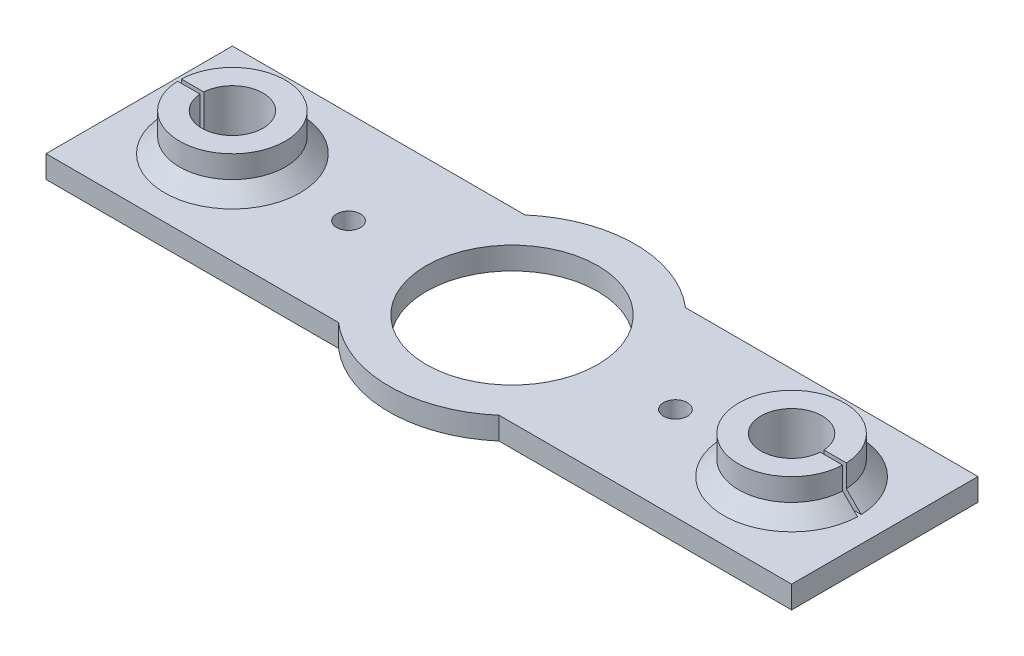
ISO-10303-21;
HEADER;
FILE_DESCRIPTION(('STEP AP214'),'2;1');
FILE_NAME('part.step','',(''),(''),'','','');
FILE_SCHEMA(('AUTOMOTIVE_DESIGN { 1 0 10303 214 1 1 1 1 }'));
ENDSEC;
DATA;
#1=APPLICATION_CONTEXT('core data for automotive mechanical design processes');
#2=APPLICATION_PROTOCOL_DEFINITION('international standard','automotive_design',2000,#1);
#3=PRODUCT_CONTEXT('',#1,'mechanical');
#4=PRODUCT('Part','Part','',(#3));
#5=PRODUCT_RELATED_PRODUCT_CATEGORY('part','',(#4));
#6=PRODUCT_DEFINITION_FORMATION('','',#4);
#7=PRODUCT_DEFINITION_CONTEXT('part definition',#1,'design');
#8=PRODUCT_DEFINITION('design','',#6,#7);
#9=PRODUCT_DEFINITION_SHAPE('','',#8);
#10=(LENGTH_UNIT() NAMED_UNIT(*) SI_UNIT(.MILLI.,.METRE.));
#11=(NAMED_UNIT(*) PLANE_ANGLE_UNIT() SI_UNIT($,.RADIAN.));
#12=(NAMED_UNIT(*) SI_UNIT($,.STERADIAN.) SOLID_ANGLE_UNIT());
#13=UNCERTAINTY_MEASURE_WITH_UNIT(LENGTH_MEASURE(1.E-05),#10,'distance_accuracy_value','');
#14=(GEOMETRIC_REPRESENTATION_CONTEXT(3) GLOBAL_UNCERTAINTY_ASSIGNED_CONTEXT((#13)) GLOBAL_UNIT_ASSIGNED_CONTEXT((#10,
#11,#12)) REPRESENTATION_CONTEXT('',''));
#15=CARTESIAN_POINT('',(0.,0.,0.));
#16=DIRECTION('',(0.,0.,1.));
#17=DIRECTION('',(1.,0.,0.));
#18=AXIS2_PLACEMENT_3D('',#15,#16,#17);
#19=CARTESIAN_POINT('',(0.,3.,12.5));
#20=DIRECTION('',(0.,0.,1.));
#21=DIRECTION('',(1.,0.,0.));
#22=AXIS2_PLACEMENT_3D('',#19,#20,#21);
#23=PLANE('',#22);
#24=DIRECTION('',(-1.,0.,0.));
#25=VECTOR('',#24,1.);
#26=CARTESIAN_POINT('',(0.,0.,12.5));
#27=LINE('',#26,#25);
#28=CARTESIAN_POINT('',(-10.770329614269,0.,12.5));
#29=VERTEX_POINT('',#28);
#30=CARTESIAN_POINT('',(-50.,0.,12.5));
#31=VERTEX_POINT('',#30);
#32=EDGE_CURVE('E227',#29,#31,#27,.T.);
#33=ORIENTED_EDGE('',*,*,#32,.F.);
#34=DIRECTION('',(0.,-1.,0.));
#35=VECTOR('',#34,1.);
#36=CARTESIAN_POINT('',(-10.770329614269,3.,12.5));
#37=LINE('',#36,#35);
#38=CARTESIAN_POINT('',(-10.770329614269,3.,12.5));
#39=VERTEX_POINT('',#38);
#40=EDGE_CURVE('E314',#39,#29,#37,.T.);
#41=ORIENTED_EDGE('',*,*,#40,.F.);
#42=DIRECTION('',(-1.,0.,0.));
#43=VECTOR('',#42,1.);
#44=CARTESIAN_POINT('',(0.,3.,12.5));
#45=LINE('',#44,#43);
#46=CARTESIAN_POINT('',(-50.,3.,12.5));
#47=VERTEX_POINT('',#46);
#48=EDGE_CURVE('E228',#39,#47,#45,.T.);
#49=ORIENTED_EDGE('',*,*,#48,.T.);
#50=DIRECTION('',(0.,-1.,0.));
#51=VECTOR('',#50,1.);
#52=CARTESIAN_POINT('',(-50.,3.,12.5));
#53=LINE('',#52,#51);
#54=EDGE_CURVE('E263',#47,#31,#53,.T.);
#55=ORIENTED_EDGE('',*,*,#54,.T.);
#56=EDGE_LOOP('',(#33,#41,#49,#55));
#57=FACE_BOUND('',#56,.T.);
#58=ADVANCED_FACE('F34',(#57),#23,.T.);
#59=CARTESIAN_POINT('',(0.,3.,0.));
#60=DIRECTION('',(0.,-1.,0.));
#61=DIRECTION('',(0.,0.,-1.));
#62=AXIS2_PLACEMENT_3D('',#59,#60,#61);
#63=CYLINDRICAL_SURFACE('',#62,16.5);
#64=CARTESIAN_POINT('',(0.,0.,0.));
#65=DIRECTION('',(0.,1.,0.));
#66=DIRECTION('',(0.,0.,1.));
#67=AXIS2_PLACEMENT_3D('',#64,#65,#66);
#68=CIRCLE('',#67,16.5);
#69=CARTESIAN_POINT('',(10.770329614269,0.,12.5));
#70=VERTEX_POINT('',#69);
#71=EDGE_CURVE('E266',#29,#70,#68,.T.);
#72=ORIENTED_EDGE('',*,*,#71,.T.);
#73=DIRECTION('',(0.,-1.,0.));
#74=VECTOR('',#73,1.);
#75=CARTESIAN_POINT('',(10.770329614269,3.,12.5));
#76=LINE('',#75,#74);
#77=CARTESIAN_POINT('',(10.770329614269,3.,12.5));
#78=VERTEX_POINT('',#77);
#79=EDGE_CURVE('E312',#78,#70,#76,.T.);
#80=ORIENTED_EDGE('',*,*,#79,.F.);
#81=CARTESIAN_POINT('',(0.,3.,0.));
#82=DIRECTION('',(0.,1.,0.));
#83=DIRECTION('',(0.,0.,1.));
#84=AXIS2_PLACEMENT_3D('',#81,#82,#83);
#85=CIRCLE('',#84,16.5);
#86=EDGE_CURVE('E231',#39,#78,#85,.T.);
#87=ORIENTED_EDGE('',*,*,#86,.F.);
#88=ORIENTED_EDGE('',*,*,#40,.T.);
#89=EDGE_LOOP('',(#72,#80,#87,#88));
#90=FACE_BOUND('',#89,.T.);
#91=ADVANCED_FACE('F347',(#90),#63,.T.);
#92=CARTESIAN_POINT('',(0.,3.,12.5));
#93=DIRECTION('',(0.,0.,1.));
#94=DIRECTION('',(1.,0.,0.));
#95=AXIS2_PLACEMENT_3D('',#92,#93,#94);
#96=PLANE('',#95);
#97=DIRECTION('',(-1.,0.,0.));
#98=VECTOR('',#97,1.);
#99=CARTESIAN_POINT('',(0.,0.,12.5));
#100=LINE('',#99,#98);
#101=CARTESIAN_POINT('',(50.,0.,12.5));
#102=VERTEX_POINT('',#101);
#103=EDGE_CURVE('E269',#102,#70,#100,.T.);
#104=ORIENTED_EDGE('',*,*,#103,.F.);
#105=DIRECTION('',(0.,-1.,0.));
#106=VECTOR('',#105,1.);
#107=CARTESIAN_POINT('',(50.,3.,12.5));
#108=LINE('',#107,#106);
#109=CARTESIAN_POINT('',(50.,3.,12.5));
#110=VERTEX_POINT('',#109);
#111=EDGE_CURVE('E310',#110,#102,#108,.T.);
#112=ORIENTED_EDGE('',*,*,#111,.F.);
#113=DIRECTION('',(-1.,0.,0.));
#114=VECTOR('',#113,1.);
#115=CARTESIAN_POINT('',(0.,3.,12.5));
#116=LINE('',#115,#114);
#117=EDGE_CURVE('E234',#110,#78,#116,.T.);
#118=ORIENTED_EDGE('',*,*,#117,.T.);
#119=ORIENTED_EDGE('',*,*,#79,.T.);
#120=EDGE_LOOP('',(#104,#112,#118,#119));
#121=FACE_BOUND('',#120,.T.);
#122=ADVANCED_FACE('F351',(#121),#96,.T.);
#123=CARTESIAN_POINT('',(50.,3.,0.));
#124=DIRECTION('',(-1.,0.,0.));
#125=DIRECTION('',(0.,0.,1.));
#126=AXIS2_PLACEMENT_3D('',#123,#124,#125);
#127=PLANE('',#126);
#128=DIRECTION('',(0.,0.,-1.));
#129=VECTOR('',#128,1.);
#130=CARTESIAN_POINT('',(50.,0.,0.));
#131=LINE('',#130,#129);
#132=CARTESIAN_POINT('',(50.,0.,-12.5));
#133=VERTEX_POINT('',#132);
#134=EDGE_CURVE('E272',#102,#133,#131,.T.);
#135=ORIENTED_EDGE('',*,*,#134,.T.);
#136=DIRECTION('',(0.,-1.,0.));
#137=VECTOR('',#136,1.);
#138=CARTESIAN_POINT('',(50.,3.,-12.5));
#139=LINE('',#138,#137);
#140=CARTESIAN_POINT('',(50.,3.,-12.5));
#141=VERTEX_POINT('',#140);
#142=EDGE_CURVE('E307',#141,#133,#139,.T.);
#143=ORIENTED_EDGE('',*,*,#142,.F.);
#144=DIRECTION('',(0.,0.,-1.));
#145=VECTOR('',#144,1.);
#146=CARTESIAN_POINT('',(50.,3.,0.));
#147=LINE('',#146,#145);
#148=EDGE_CURVE('E237',#110,#141,#147,.T.);
#149=ORIENTED_EDGE('',*,*,#148,.F.);
#150=ORIENTED_EDGE('',*,*,#111,.T.);
#151=EDGE_LOOP('',(#135,#143,#149,#150));
#152=FACE_BOUND('',#151,.T.);
#153=ADVANCED_FACE('F355',(#152),#127,.F.);
#154=CARTESIAN_POINT('',(0.,3.,-12.5));
#155=DIRECTION('',(0.,0.,1.));
#156=DIRECTION('',(1.,0.,0.));
#157=AXIS2_PLACEMENT_3D('',#154,#155,#156);
#158=PLANE('',#157);
#159=DIRECTION('',(-1.,0.,0.));
#160=VECTOR('',#159,1.);
#161=CARTESIAN_POINT('',(0.,0.,-12.5));
#162=LINE('',#161,#160);
#163=CARTESIAN_POINT('',(10.770329614269,0.,-12.5));
#164=VERTEX_POINT('',#163);
#165=EDGE_CURVE('E274',#133,#164,#162,.T.);
#166=ORIENTED_EDGE('',*,*,#165,.T.);
#167=DIRECTION('',(0.,-1.,0.));
#168=VECTOR('',#167,1.);
#169=CARTESIAN_POINT('',(10.770329614269,3.,-12.5));
#170=LINE('',#169,#168);
#171=CARTESIAN_POINT('',(10.770329614269,3.,-12.5));
#172=VERTEX_POINT('',#171);
#173=EDGE_CURVE('E304',#172,#164,#170,.T.);
#174=ORIENTED_EDGE('',*,*,#173,.F.);
#175=DIRECTION('',(-1.,0.,0.));
#176=VECTOR('',#175,1.);
#177=CARTESIAN_POINT('',(0.,3.,-12.5));
#178=LINE('',#177,#176);
#179=EDGE_CURVE('E239',#141,#172,#178,.T.);
#180=ORIENTED_EDGE('',*,*,#179,.F.);
#181=ORIENTED_EDGE('',*,*,#142,.T.);
#182=EDGE_LOOP('',(#166,#174,#180,#181));
#183=FACE_BOUND('',#182,.T.);
#184=ADVANCED_FACE('F359',(#183),#158,.F.);
#185=CARTESIAN_POINT('',(0.,3.,0.));
#186=DIRECTION('',(0.,-1.,0.));
#187=DIRECTION('',(0.,0.,-1.));
#188=AXIS2_PLACEMENT_3D('',#185,#186,#187);
#189=CYLINDRICAL_SURFACE('',#188,16.5);
#190=CARTESIAN_POINT('',(0.,0.,0.));
#191=DIRECTION('',(0.,1.,0.));
#192=DIRECTION('',(0.,0.,1.));
#193=AXIS2_PLACEMENT_3D('',#190,#191,#192);
#194=CIRCLE('',#193,16.5);
#195=CARTESIAN_POINT('',(-10.770329614269,0.,-12.5));
#196=VERTEX_POINT('',#195);
#197=EDGE_CURVE('E276',#164,#196,#194,.T.);
#198=ORIENTED_EDGE('',*,*,#197,.T.);
#199=DIRECTION('',(0.,-1.,0.));
#200=VECTOR('',#199,1.);
#201=CARTESIAN_POINT('',(-10.770329614269,3.,-12.5));
#202=LINE('',#201,#200);
#203=CARTESIAN_POINT('',(-10.770329614269,3.,-12.5));
#204=VERTEX_POINT('',#203);
#205=EDGE_CURVE('E301',#204,#196,#202,.T.);
#206=ORIENTED_EDGE('',*,*,#205,.F.);
#207=CARTESIAN_POINT('',(0.,3.,0.));
#208=DIRECTION('',(0.,1.,0.));
#209=DIRECTION('',(0.,0.,1.));
#210=AXIS2_PLACEMENT_3D('',#207,#208,#209);
#211=CIRCLE('',#210,16.5);
#212=EDGE_CURVE('E241',#172,#204,#211,.T.);
#213=ORIENTED_EDGE('',*,*,#212,.F.);
#214=ORIENTED_EDGE('',*,*,#173,.T.);
#215=EDGE_LOOP('',(#198,#206,#213,#214));
#216=FACE_BOUND('',#215,.T.);
#217=ADVANCED_FACE('F363',(#216),#189,.T.);
#218=CARTESIAN_POINT('',(0.,3.,-12.5));
#219=DIRECTION('',(0.,0.,1.));
#220=DIRECTION('',(1.,0.,0.));
#221=AXIS2_PLACEMENT_3D('',#218,#219,#220);
#222=PLANE('',#221);
#223=DIRECTION('',(-1.,0.,0.));
#224=VECTOR('',#223,1.);
#225=CARTESIAN_POINT('',(0.,0.,-12.5));
#226=LINE('',#225,#224);
#227=CARTESIAN_POINT('',(-50.,0.,-12.5));
#228=VERTEX_POINT('',#227);
#229=EDGE_CURVE('E278',#196,#228,#226,.T.);
#230=ORIENTED_EDGE('',*,*,#229,.T.);
#231=DIRECTION('',(0.,-1.,0.));
#232=VECTOR('',#231,1.);
#233=CARTESIAN_POINT('',(-50.,3.,-12.5));
#234=LINE('',#233,#232);
#235=CARTESIAN_POINT('',(-50.,3.,-12.5));
#236=VERTEX_POINT('',#235);
#237=EDGE_CURVE('E299',#236,#228,#234,.T.);
#238=ORIENTED_EDGE('',*,*,#237,.F.);
#239=DIRECTION('',(-1.,0.,0.));
#240=VECTOR('',#239,1.);
#241=CARTESIAN_POINT('',(0.,3.,-12.5));
#242=LINE('',#241,#240);
#243=EDGE_CURVE('E243',#204,#236,#242,.T.);
#244=ORIENTED_EDGE('',*,*,#243,.F.);
#245=ORIENTED_EDGE('',*,*,#205,.T.);
#246=EDGE_LOOP('',(#230,#238,#244,#245));
#247=FACE_BOUND('',#246,.T.);
#248=ADVANCED_FACE('F367',(#247),#222,.F.);
#249=CARTESIAN_POINT('',(21.92,3.,0.));
#250=DIRECTION('',(0.,-1.,0.));
#251=DIRECTION('',(0.,0.,-1.));
#252=AXIS2_PLACEMENT_3D('',#249,#250,#251);
#253=CYLINDRICAL_SURFACE('',#252,1.6);
#254=CARTESIAN_POINT('',(21.92,3.,0.));
#255=DIRECTION('',(0.,1.,0.));
#256=DIRECTION('',(0.,0.,1.));
#257=AXIS2_PLACEMENT_3D('',#254,#255,#256);
#258=CIRCLE('',#257,1.6);
#259=CARTESIAN_POINT('',(21.92,3.,1.6));
#260=VERTEX_POINT('',#259);
#261=EDGE_CURVE('E257',#260,#260,#258,.F.);
#262=ORIENTED_EDGE('',*,*,#261,.F.);
#263=EDGE_LOOP('',(#262));
#264=FACE_BOUND('',#263,.T.);
#265=CARTESIAN_POINT('',(21.92,0.,0.));
#266=DIRECTION('',(0.,1.,0.));
#267=DIRECTION('',(0.,0.,1.));
#268=AXIS2_PLACEMENT_3D('',#265,#266,#267);
#269=CIRCLE('',#268,1.6);
#270=CARTESIAN_POINT('',(21.92,0.,1.6));
#271=VERTEX_POINT('',#270);
#272=EDGE_CURVE('E293',#271,#271,#269,.F.);
#273=ORIENTED_EDGE('',*,*,#272,.T.);
#274=EDGE_LOOP('',(#273));
#275=FACE_BOUND('',#274,.T.);
#276=ADVANCED_FACE('F371',(#264,#275),#253,.F.);
#277=CARTESIAN_POINT('',(0.,3.,0.));
#278=DIRECTION('',(0.,-1.,0.));
#279=DIRECTION('',(0.,0.,-1.));
#280=AXIS2_PLACEMENT_3D('',#277,#278,#279);
#281=CYLINDRICAL_SURFACE('',#280,11.5);
#282=CARTESIAN_POINT('',(0.,3.,0.));
#283=DIRECTION('',(0.,1.,0.));
#284=DIRECTION('',(0.,0.,1.));
#285=AXIS2_PLACEMENT_3D('',#282,#283,#284);
#286=CIRCLE('',#285,11.5);
#287=CARTESIAN_POINT('',(0.,3.,11.5));
#288=VERTEX_POINT('',#287);
#289=EDGE_CURVE('E254',#288,#288,#286,.T.);
#290=ORIENTED_EDGE('',*,*,#289,.T.);
#291=EDGE_LOOP('',(#290));
#292=FACE_BOUND('',#291,.T.);
#293=CARTESIAN_POINT('',(0.,0.,0.));
#294=DIRECTION('',(0.,1.,0.));
#295=DIRECTION('',(0.,0.,1.));
#296=AXIS2_PLACEMENT_3D('',#293,#294,#295);
#297=CIRCLE('',#296,11.5);
#298=CARTESIAN_POINT('',(0.,0.,11.5));
#299=VERTEX_POINT('',#298);
#300=EDGE_CURVE('E290',#299,#299,#297,.T.);
#301=ORIENTED_EDGE('',*,*,#300,.F.);
#302=EDGE_LOOP('',(#301));
#303=FACE_BOUND('',#302,.T.);
#304=ADVANCED_FACE('F385',(#292,#303),#281,.F.);
#305=CARTESIAN_POINT('',(-21.92,3.,0.));
#306=DIRECTION('',(0.,-1.,0.));
#307=DIRECTION('',(0.,0.,-1.));
#308=AXIS2_PLACEMENT_3D('',#305,#306,#307);
#309=CYLINDRICAL_SURFACE('',#308,1.6);
#310=CARTESIAN_POINT('',(-21.92,3.,0.));
#311=DIRECTION('',(0.,1.,0.));
#312=DIRECTION('',(0.,0.,1.));
#313=AXIS2_PLACEMENT_3D('',#310,#311,#312);
#314=CIRCLE('',#313,1.6);
#315=CARTESIAN_POINT('',(-21.92,3.,1.6));
#316=VERTEX_POINT('',#315);
#317=EDGE_CURVE('E251',#316,#316,#314,.T.);
#318=ORIENTED_EDGE('',*,*,#317,.T.);
#319=EDGE_LOOP('',(#318));
#320=FACE_BOUND('',#319,.T.);
#321=CARTESIAN_POINT('',(-21.92,0.,0.));
#322=DIRECTION('',(0.,1.,0.));
#323=DIRECTION('',(0.,0.,1.));
#324=AXIS2_PLACEMENT_3D('',#321,#322,#323);
#325=CIRCLE('',#324,1.6);
#326=CARTESIAN_POINT('',(-21.92,0.,1.6));
#327=VERTEX_POINT('',#326);
#328=EDGE_CURVE('E287',#327,#327,#325,.T.);
#329=ORIENTED_EDGE('',*,*,#328,.F.);
#330=EDGE_LOOP('',(#329));
#331=FACE_BOUND('',#330,.T.);
#332=ADVANCED_FACE('F381',(#320,#331),#309,.F.);
#333=CARTESIAN_POINT('',(-37.5,3.,0.));
#334=DIRECTION('',(0.,-1.,0.));
#335=DIRECTION('',(0.,0.,-1.));
#336=AXIS2_PLACEMENT_3D('',#333,#334,#335);
#337=CYLINDRICAL_SURFACE('',#336,4.1);
#338=CARTESIAN_POINT('',(-37.5,3.,0.));
#339=DIRECTION('',(0.,1.,0.));
#340=DIRECTION('',(0.,0.,1.));
#341=AXIS2_PLACEMENT_3D('',#338,#339,#340);
#342=CIRCLE('',#341,4.1);
#343=CARTESIAN_POINT('',(-41.5923709509281,3.,-0.249999999999995));
#344=VERTEX_POINT('',#343);
#345=CARTESIAN_POINT('',(-41.5923709509281,3.,0.250000000000005));
#346=VERTEX_POINT('',#345);
#347=EDGE_CURVE('E248',#344,#346,#342,.T.);
#348=ORIENTED_EDGE('',*,*,#347,.T.);
#349=DIRECTION('',(0.,-1.,0.));
#350=VECTOR('',#349,1.);
#351=CARTESIAN_POINT('',(-41.5923709509281,8.,0.250000000000005));
#352=LINE('',#351,#350);
#353=CARTESIAN_POINT('',(-41.5923709509281,8.,0.250000000000005));
#354=VERTEX_POINT('',#353);
#355=EDGE_CURVE('E214',#354,#346,#352,.T.);
#356=ORIENTED_EDGE('',*,*,#355,.F.);
#357=CARTESIAN_POINT('',(-37.5,8.,0.));
#358=DIRECTION('',(0.,1.,0.));
#359=DIRECTION('',(0.,0.,1.));
#360=AXIS2_PLACEMENT_3D('',#357,#358,#359);
#361=CIRCLE('',#360,4.1);
#362=CARTESIAN_POINT('',(-41.5923709509281,8.,-0.249999999999995));
#363=VERTEX_POINT('',#362);
#364=EDGE_CURVE('E212',#363,#354,#361,.F.);
#365=ORIENTED_EDGE('',*,*,#364,.F.);
#366=DIRECTION('',(0.,-1.,0.));
#367=VECTOR('',#366,1.);
#368=CARTESIAN_POINT('',(-41.5923709509281,8.,-0.249999999999995));
#369=LINE('',#368,#367);
#370=EDGE_CURVE('E219',#363,#344,#369,.T.);
#371=ORIENTED_EDGE('',*,*,#370,.T.);
#372=EDGE_LOOP('',(#348,#356,#365,#371));
#373=FACE_BOUND('',#372,.T.);
#374=CARTESIAN_POINT('',(-37.5,0.,0.));
#375=DIRECTION('',(0.,1.,0.));
#376=DIRECTION('',(0.,0.,1.));
#377=AXIS2_PLACEMENT_3D('',#374,#375,#376);
#378=CIRCLE('',#377,4.1);
#379=CARTESIAN_POINT('',(-37.5,0.,4.1));
#380=VERTEX_POINT('',#379);
#381=EDGE_CURVE('E284',#380,#380,#378,.T.);
#382=ORIENTED_EDGE('',*,*,#381,.F.);
#383=EDGE_LOOP('',(#382));
#384=FACE_BOUND('',#383,.T.);
#385=ADVANCED_FACE('F377',(#373,#384),#337,.F.);
#386=CARTESIAN_POINT('',(-50.,3.,0.));
#387=DIRECTION('',(-1.,0.,0.));
#388=DIRECTION('',(0.,0.,1.));
#389=AXIS2_PLACEMENT_3D('',#386,#387,#388);
#390=PLANE('',#389);
#391=DIRECTION('',(0.,0.,-1.));
#392=VECTOR('',#391,1.);
#393=CARTESIAN_POINT('',(-50.,0.,0.));
#394=LINE('',#393,#392);
#395=EDGE_CURVE('E281',#31,#228,#394,.T.);
#396=ORIENTED_EDGE('',*,*,#395,.F.);
#397=ORIENTED_EDGE('',*,*,#54,.F.);
#398=DIRECTION('',(0.,0.,-1.));
#399=VECTOR('',#398,1.);
#400=CARTESIAN_POINT('',(-50.,3.,0.));
#401=LINE('',#400,#399);
#402=EDGE_CURVE('E245',#47,#236,#401,.T.);
#403=ORIENTED_EDGE('',*,*,#402,.T.);
#404=ORIENTED_EDGE('',*,*,#237,.T.);
#405=EDGE_LOOP('',(#396,#397,#403,#404));
#406=FACE_BOUND('',#405,.T.);
#407=ADVANCED_FACE('F373',(#406),#390,.T.);
#408=CARTESIAN_POINT('',(37.5,3.,0.));
#409=DIRECTION('',(0.,-1.,0.));
#410=DIRECTION('',(0.,0.,-1.));
#411=AXIS2_PLACEMENT_3D('',#408,#409,#410);
#412=CYLINDRICAL_SURFACE('',#411,4.1);
#413=CARTESIAN_POINT('',(37.5,3.,0.));
#414=DIRECTION('',(0.,1.,0.));
#415=DIRECTION('',(0.,0.,1.));
#416=AXIS2_PLACEMENT_3D('',#413,#414,#415);
#417=CIRCLE('',#416,4.1);
#418=CARTESIAN_POINT('',(41.5923709509281,3.,-0.249999999999995));
#419=VERTEX_POINT('',#418);
#420=CARTESIAN_POINT('',(41.5923709509281,3.,0.250000000000005));
#421=VERTEX_POINT('',#420);
#422=EDGE_CURVE('E260',#419,#421,#417,.F.);
#423=ORIENTED_EDGE('',*,*,#422,.F.);
#424=DIRECTION('',(0.,-1.,0.));
#425=VECTOR('',#424,1.);
#426=CARTESIAN_POINT('',(41.5923709509281,8.,-0.249999999999995));
#427=LINE('',#426,#425);
#428=CARTESIAN_POINT('',(41.5923709509281,8.,-0.249999999999995));
#429=VERTEX_POINT('',#428);
#430=EDGE_CURVE('E200',#429,#419,#427,.T.);
#431=ORIENTED_EDGE('',*,*,#430,.F.);
#432=CARTESIAN_POINT('',(37.5,8.,0.));
#433=DIRECTION('',(0.,1.,0.));
#434=DIRECTION('',(0.,0.,1.));
#435=AXIS2_PLACEMENT_3D('',#432,#433,#434);
#436=CIRCLE('',#435,4.1);
#437=CARTESIAN_POINT('',(41.5923709509281,8.,0.250000000000005));
#438=VERTEX_POINT('',#437);
#439=EDGE_CURVE('E190',#438,#429,#436,.F.);
#440=ORIENTED_EDGE('',*,*,#439,.F.);
#441=DIRECTION('',(0.,-1.,0.));
#442=VECTOR('',#441,1.);
#443=CARTESIAN_POINT('',(41.5923709509281,8.,0.250000000000005));
#444=LINE('',#443,#442);
#445=EDGE_CURVE('E176',#438,#421,#444,.T.);
#446=ORIENTED_EDGE('',*,*,#445,.T.);
#447=EDGE_LOOP('',(#423,#431,#440,#446));
#448=FACE_BOUND('',#447,.T.);
#449=CARTESIAN_POINT('',(37.5,0.,0.));
#450=DIRECTION('',(0.,1.,0.));
#451=DIRECTION('',(0.,0.,1.));
#452=AXIS2_PLACEMENT_3D('',#449,#450,#451);
#453=CIRCLE('',#452,4.1);
#454=CARTESIAN_POINT('',(37.5,0.,4.1));
#455=VERTEX_POINT('',#454);
#456=EDGE_CURVE('E232',#455,#455,#453,.F.);
#457=ORIENTED_EDGE('',*,*,#456,.T.);
#458=EDGE_LOOP('',(#457));
#459=FACE_BOUND('',#458,.T.);
#460=ADVANCED_FACE('F376',(#448,#459),#412,.F.);
#461=CARTESIAN_POINT('',(0.,3.,0.));
#462=DIRECTION('',(0.,1.,0.));
#463=DIRECTION('',(0.,0.,1.));
#464=AXIS2_PLACEMENT_3D('',#461,#462,#463);
#465=PLANE('',#464);
#466=CARTESIAN_POINT('',(37.5,3.,0.));
#467=DIRECTION('',(0.,1.,0.));
#468=DIRECTION('',(0.,0.,1.));
#469=AXIS2_PLACEMENT_3D('',#466,#467,#468);
#470=CIRCLE('',#469,9.09754007086547);
#471=CARTESIAN_POINT('',(46.59410442765,3.,0.250000000000006));
#472=VERTEX_POINT('',#471);
#473=CARTESIAN_POINT('',(46.59410442765,3.,-0.249999999999994));
#474=VERTEX_POINT('',#473);
#475=EDGE_CURVE('E319',#472,#474,#470,.F.);
#476=ORIENTED_EDGE('',*,*,#475,.T.);
#477=DIRECTION('',(1.,0.,0.));
#478=VECTOR('',#477,1.);
#479=CARTESIAN_POINT('',(0.,3.,-0.250000000000001));
#480=LINE('',#479,#478);
#481=EDGE_CURVE('E185',#419,#474,#480,.T.);
#482=ORIENTED_EDGE('',*,*,#481,.F.);
#483=ORIENTED_EDGE('',*,*,#422,.T.);
#484=DIRECTION('',(1.,0.,0.));
#485=VECTOR('',#484,1.);
#486=CARTESIAN_POINT('',(0.,3.,0.250000000000001));
#487=LINE('',#486,#485);
#488=EDGE_CURVE('E196',#421,#472,#487,.T.);
#489=ORIENTED_EDGE('',*,*,#488,.T.);
#490=EDGE_LOOP('',(#476,#482,#483,#489));
#491=FACE_BOUND('',#490,.T.);
#492=DIRECTION('',(-1.,0.,0.));
#493=VECTOR('',#492,1.);
#494=CARTESIAN_POINT('',(0.,3.,-0.250000000000001));
#495=LINE('',#494,#493);
#496=CARTESIAN_POINT('',(-46.5941044276499,3.,-0.249999999999994));
#497=VERTEX_POINT('',#496);
#498=EDGE_CURVE('E207',#344,#497,#495,.T.);
#499=ORIENTED_EDGE('',*,*,#498,.T.);
#500=CARTESIAN_POINT('',(-37.5,3.,0.));
#501=DIRECTION('',(0.,1.,0.));
#502=DIRECTION('',(0.,0.,1.));
#503=AXIS2_PLACEMENT_3D('',#500,#501,#502);
#504=CIRCLE('',#503,9.09754007086541);
#505=CARTESIAN_POINT('',(-46.5941044276499,3.,0.250000000000006));
#506=VERTEX_POINT('',#505);
#507=EDGE_CURVE('E316',#497,#506,#504,.F.);
#508=ORIENTED_EDGE('',*,*,#507,.T.);
#509=DIRECTION('',(-1.,0.,0.));
#510=VECTOR('',#509,1.);
#511=CARTESIAN_POINT('',(0.,3.,0.250000000000001));
#512=LINE('',#511,#510);
#513=EDGE_CURVE('E175',#346,#506,#512,.T.);
#514=ORIENTED_EDGE('',*,*,#513,.F.);
#515=ORIENTED_EDGE('',*,*,#347,.F.);
#516=EDGE_LOOP('',(#499,#508,#514,#515));
#517=FACE_BOUND('',#516,.T.);
#518=ORIENTED_EDGE('',*,*,#48,.F.);
#519=ORIENTED_EDGE('',*,*,#86,.T.);
#520=ORIENTED_EDGE('',*,*,#117,.F.);
#521=ORIENTED_EDGE('',*,*,#148,.T.);
#522=ORIENTED_EDGE('',*,*,#179,.T.);
#523=ORIENTED_EDGE('',*,*,#212,.T.);
#524=ORIENTED_EDGE('',*,*,#243,.T.);
#525=ORIENTED_EDGE('',*,*,#402,.F.);
#526=EDGE_LOOP('',(#518,#519,#520,#521,#522,#523,#524,#525));
#527=FACE_BOUND('',#526,.T.);
#528=ORIENTED_EDGE('',*,*,#317,.F.);
#529=EDGE_LOOP('',(#528));
#530=FACE_BOUND('',#529,.T.);
#531=ORIENTED_EDGE('',*,*,#289,.F.);
#532=EDGE_LOOP('',(#531));
#533=FACE_BOUND('',#532,.T.);
#534=ORIENTED_EDGE('',*,*,#261,.T.);
#535=EDGE_LOOP('',(#534));
#536=FACE_BOUND('',#535,.T.);
#537=ADVANCED_FACE('F395',(#491,#517,#527,#530,#533,#536),#465,.T.);
#538=CARTESIAN_POINT('',(0.,0.,0.));
#539=DIRECTION('',(0.,1.,0.));
#540=DIRECTION('',(0.,0.,1.));
#541=AXIS2_PLACEMENT_3D('',#538,#539,#540);
#542=PLANE('',#541);
#543=ORIENTED_EDGE('',*,*,#32,.T.);
#544=ORIENTED_EDGE('',*,*,#395,.T.);
#545=ORIENTED_EDGE('',*,*,#229,.F.);
#546=ORIENTED_EDGE('',*,*,#197,.F.);
#547=ORIENTED_EDGE('',*,*,#165,.F.);
#548=ORIENTED_EDGE('',*,*,#134,.F.);
#549=ORIENTED_EDGE('',*,*,#103,.T.);
#550=ORIENTED_EDGE('',*,*,#71,.F.);
#551=EDGE_LOOP('',(#543,#544,#545,#546,#547,#548,#549,#550));
#552=FACE_BOUND('',#551,.T.);
#553=ORIENTED_EDGE('',*,*,#381,.T.);
#554=EDGE_LOOP('',(#553));
#555=FACE_BOUND('',#554,.T.);
#556=ORIENTED_EDGE('',*,*,#328,.T.);
#557=EDGE_LOOP('',(#556));
#558=FACE_BOUND('',#557,.T.);
#559=ORIENTED_EDGE('',*,*,#300,.T.);
#560=EDGE_LOOP('',(#559));
#561=FACE_BOUND('',#560,.T.);
#562=ORIENTED_EDGE('',*,*,#272,.F.);
#563=EDGE_LOOP('',(#562));
#564=FACE_BOUND('',#563,.T.);
#565=ORIENTED_EDGE('',*,*,#456,.F.);
#566=EDGE_LOOP('',(#565));
#567=FACE_BOUND('',#566,.T.);
#568=ADVANCED_FACE('F397',(#552,#555,#558,#561,#564,#567),#542,.F.);
#569=CARTESIAN_POINT('',(0.,8.,0.250000000000001));
#570=DIRECTION('',(0.,0.,1.));
#571=DIRECTION('',(1.,0.,0.));
#572=AXIS2_PLACEMENT_3D('',#569,#570,#571);
#573=PLANE('',#572);
#574=ORIENTED_EDGE('',*,*,#513,.T.);
#575=CARTESIAN_POINT('',(-46.5941044276499,3.,0.250000000000006));
#576=CARTESIAN_POINT('',(-46.2606295935804,3.33335328505449,0.250000000000006));
#577=CARTESIAN_POINT('',(-45.9271447884612,3.66669659422999,0.250000000000006));
#578=CARTESIAN_POINT('',(-45.2601552360495,4.33336326089666,0.250000000000005));
#579=CARTESIAN_POINT('',(-44.9266504887571,4.66668661838783,0.250000000000005));
#580=CARTESIAN_POINT('',(-44.593135770415,4.99999999999999,0.250000000000005));
#581=B_SPLINE_CURVE_WITH_KNOTS('',3,(#575,#576,#577,#578,#579,#580),.UNSPECIFIED.,.F.,.F.,(4,2,
4),(0.,1.4145560763566,2.82911215302582),.UNSPECIFIED.);
#582=CARTESIAN_POINT('',(-44.593135770415,4.99999999999999,0.250000000000005));
#583=VERTEX_POINT('',#582);
#584=EDGE_CURVE('E11',#506,#583,#581,.T.);
#585=ORIENTED_EDGE('',*,*,#584,.T.);
#586=DIRECTION('',(0.,-1.,0.));
#587=VECTOR('',#586,1.);
#588=CARTESIAN_POINT('',(-44.593135770415,8.,0.250000000000005));
#589=LINE('',#588,#587);
#590=CARTESIAN_POINT('',(-44.593135770415,8.,0.250000000000005));
#591=VERTEX_POINT('',#590);
#592=EDGE_CURVE('E225',#591,#583,#589,.T.);
#593=ORIENTED_EDGE('',*,*,#592,.F.);
#594=DIRECTION('',(-1.,0.,0.));
#595=VECTOR('',#594,1.);
#596=CARTESIAN_POINT('',(0.,8.,0.250000000000001));
#597=LINE('',#596,#595);
#598=EDGE_CURVE('E203',#354,#591,#597,.T.);
#599=ORIENTED_EDGE('',*,*,#598,.F.);
#600=ORIENTED_EDGE('',*,*,#355,.T.);
#601=EDGE_LOOP('',(#574,#585,#593,#599,#600));
#602=FACE_BOUND('',#601,.T.);
#603=ADVANCED_FACE('F400',(#602),#573,.F.);
#604=CARTESIAN_POINT('',(-37.5,8.,0.));
#605=DIRECTION('',(0.,-1.,0.));
#606=DIRECTION('',(0.,0.,-1.));
#607=AXIS2_PLACEMENT_3D('',#604,#605,#606);
#608=CYLINDRICAL_SURFACE('',#607,7.09754007086545);
#609=ORIENTED_EDGE('',*,*,#592,.T.);
#610=CARTESIAN_POINT('',(-37.5,4.99999999999999,0.));
#611=DIRECTION('',(0.,1.,0.));
#612=DIRECTION('',(0.,0.,1.));
#613=AXIS2_PLACEMENT_3D('',#610,#611,#612);
#614=CIRCLE('',#613,7.09754007086545);
#615=CARTESIAN_POINT('',(-44.593135770415,4.99999999999999,-0.249999999999994));
#616=VERTEX_POINT('',#615);
#617=EDGE_CURVE('E323',#583,#616,#614,.T.);
#618=ORIENTED_EDGE('',*,*,#617,.T.);
#619=DIRECTION('',(0.,-1.,0.));
#620=VECTOR('',#619,1.);
#621=CARTESIAN_POINT('',(-44.593135770415,8.,-0.249999999999994));
#622=LINE('',#621,#620);
#623=CARTESIAN_POINT('',(-44.593135770415,8.,-0.249999999999994));
#624=VERTEX_POINT('',#623);
#625=EDGE_CURVE('E222',#624,#616,#622,.T.);
#626=ORIENTED_EDGE('',*,*,#625,.F.);
#627=CARTESIAN_POINT('',(-37.5,8.,0.));
#628=DIRECTION('',(0.,1.,0.));
#629=DIRECTION('',(0.,0.,1.));
#630=AXIS2_PLACEMENT_3D('',#627,#628,#629);
#631=CIRCLE('',#630,7.09754007086545);
#632=EDGE_CURVE('E206',#591,#624,#631,.T.);
#633=ORIENTED_EDGE('',*,*,#632,.F.);
#634=EDGE_LOOP('',(#609,#618,#626,#633));
#635=FACE_BOUND('',#634,.T.);
#636=ADVANCED_FACE('F407',(#635),#608,.T.);
#637=CARTESIAN_POINT('',(0.,8.,-0.250000000000001));
#638=DIRECTION('',(0.,0.,1.));
#639=DIRECTION('',(1.,0.,0.));
#640=AXIS2_PLACEMENT_3D('',#637,#638,#639);
#641=PLANE('',#640);
#642=ORIENTED_EDGE('',*,*,#498,.F.);
#643=ORIENTED_EDGE('',*,*,#370,.F.);
#644=DIRECTION('',(-1.,0.,0.));
#645=VECTOR('',#644,1.);
#646=CARTESIAN_POINT('',(0.,8.,-0.250000000000001));
#647=LINE('',#646,#645);
#648=EDGE_CURVE('E209',#363,#624,#647,.T.);
#649=ORIENTED_EDGE('',*,*,#648,.T.);
#650=ORIENTED_EDGE('',*,*,#625,.T.);
#651=CARTESIAN_POINT('',(-44.593135770415,4.99999999999999,-0.249999999999994));
#652=CARTESIAN_POINT('',(-44.9266504887571,4.66668661838783,-0.249999999999994));
#653=CARTESIAN_POINT('',(-45.2601552360495,4.33336326089666,-0.249999999999994));
#654=CARTESIAN_POINT('',(-45.9271447884612,3.66669659422999,-0.249999999999994));
#655=CARTESIAN_POINT('',(-46.2606295935804,3.33335328505449,-0.249999999999994));
#656=CARTESIAN_POINT('',(-46.5941044276499,3.,-0.249999999999994));
#657=B_SPLINE_CURVE_WITH_KNOTS('',3,(#651,#652,#653,#654,#655,#656),.UNSPECIFIED.,.F.,.F.,(4,2,
4),(0.,1.41455607666922,2.82911215302582),.UNSPECIFIED.);
#658=EDGE_CURVE('E47',#616,#497,#657,.T.);
#659=ORIENTED_EDGE('',*,*,#658,.T.);
#660=EDGE_LOOP('',(#642,#643,#649,#650,#659));
#661=FACE_BOUND('',#660,.T.);
#662=ADVANCED_FACE('F410',(#661),#641,.T.);
#663=CARTESIAN_POINT('',(0.,8.,0.));
#664=DIRECTION('',(0.,1.,0.));
#665=DIRECTION('',(0.,0.,1.));
#666=AXIS2_PLACEMENT_3D('',#663,#664,#665);
#667=PLANE('',#666);
#668=ORIENTED_EDGE('',*,*,#598,.T.);
#669=ORIENTED_EDGE('',*,*,#632,.T.);
#670=ORIENTED_EDGE('',*,*,#648,.F.);
#671=ORIENTED_EDGE('',*,*,#364,.T.);
#672=EDGE_LOOP('',(#668,#669,#670,#671));
#673=FACE_BOUND('',#672,.T.);
#674=ADVANCED_FACE('F415',(#673),#667,.T.);
#675=CARTESIAN_POINT('',(37.5,8.,0.));
#676=DIRECTION('',(0.,-1.,0.));
#677=DIRECTION('',(0.,0.,-1.));
#678=AXIS2_PLACEMENT_3D('',#675,#676,#677);
#679=CYLINDRICAL_SURFACE('',#678,7.09754007086545);
#680=DIRECTION('',(0.,-1.,0.));
#681=VECTOR('',#680,1.);
#682=CARTESIAN_POINT('',(44.593135770415,8.,-0.249999999999994));
#683=LINE('',#682,#681);
#684=CARTESIAN_POINT('',(44.593135770415,8.,-0.249999999999994));
#685=VERTEX_POINT('',#684);
#686=CARTESIAN_POINT('',(44.593135770415,4.99999999999999,-0.249999999999994));
#687=VERTEX_POINT('',#686);
#688=EDGE_CURVE('E195',#685,#687,#683,.T.);
#689=ORIENTED_EDGE('',*,*,#688,.T.);
#690=CARTESIAN_POINT('',(37.5,4.99999999999999,0.));
#691=DIRECTION('',(0.,1.,0.));
#692=DIRECTION('',(0.,0.,1.));
#693=AXIS2_PLACEMENT_3D('',#690,#691,#692);
#694=CIRCLE('',#693,7.09754007086545);
#695=CARTESIAN_POINT('',(44.593135770415,4.99999999999999,0.250000000000005));
#696=VERTEX_POINT('',#695);
#697=EDGE_CURVE('E170',#687,#696,#694,.T.);
#698=ORIENTED_EDGE('',*,*,#697,.T.);
#699=DIRECTION('',(0.,-1.,0.));
#700=VECTOR('',#699,1.);
#701=CARTESIAN_POINT('',(44.593135770415,8.,0.250000000000005));
#702=LINE('',#701,#700);
#703=CARTESIAN_POINT('',(44.593135770415,8.,0.250000000000005));
#704=VERTEX_POINT('',#703);
#705=EDGE_CURVE('E164',#704,#696,#702,.T.);
#706=ORIENTED_EDGE('',*,*,#705,.F.);
#707=CARTESIAN_POINT('',(37.5,8.,0.));
#708=DIRECTION('',(0.,1.,0.));
#709=DIRECTION('',(0.,0.,1.));
#710=AXIS2_PLACEMENT_3D('',#707,#708,#709);
#711=CIRCLE('',#710,7.09754007086545);
#712=EDGE_CURVE('E168',#704,#685,#711,.F.);
#713=ORIENTED_EDGE('',*,*,#712,.T.);
#714=EDGE_LOOP('',(#689,#698,#706,#713));
#715=FACE_BOUND('',#714,.T.);
#716=ADVANCED_FACE('F167',(#715),#679,.T.);
#717=CARTESIAN_POINT('',(0.,8.,0.250000000000001));
#718=DIRECTION('',(0.,0.,-1.));
#719=DIRECTION('',(-1.,0.,0.));
#720=AXIS2_PLACEMENT_3D('',#717,#718,#719);
#721=PLANE('',#720);
#722=ORIENTED_EDGE('',*,*,#488,.F.);
#723=ORIENTED_EDGE('',*,*,#445,.F.);
#724=DIRECTION('',(1.,0.,0.));
#725=VECTOR('',#724,1.);
#726=CARTESIAN_POINT('',(0.,8.,0.250000000000001));
#727=LINE('',#726,#725);
#728=EDGE_CURVE('E181',#438,#704,#727,.T.);
#729=ORIENTED_EDGE('',*,*,#728,.T.);
#730=ORIENTED_EDGE('',*,*,#705,.T.);
#731=CARTESIAN_POINT('',(44.593135770415,4.99999999999999,0.250000000000006));
#732=CARTESIAN_POINT('',(44.9266504887572,4.66668661838783,0.250000000000006));
#733=CARTESIAN_POINT('',(45.2601552360496,4.33336326089666,0.250000000000006));
#734=CARTESIAN_POINT('',(45.9271447884612,3.66669659422999,0.250000000000006));
#735=CARTESIAN_POINT('',(46.2606295935805,3.3333532850545,0.250000000000006));
#736=CARTESIAN_POINT('',(46.59410442765,3.,0.250000000000006));
#737=B_SPLINE_CURVE_WITH_KNOTS('',3,(#731,#732,#733,#734,#735,#736),.UNSPECIFIED.,.F.,.F.,(4,2,
4),(0.,1.41455607666923,2.82911215302585),.UNSPECIFIED.);
#738=EDGE_CURVE('E331',#696,#472,#737,.T.);
#739=ORIENTED_EDGE('',*,*,#738,.T.);
#740=EDGE_LOOP('',(#722,#723,#729,#730,#739));
#741=FACE_BOUND('',#740,.T.);
#742=ADVANCED_FACE('F188',(#741),#721,.T.);
#743=CARTESIAN_POINT('',(0.,8.,-0.250000000000001));
#744=DIRECTION('',(0.,0.,-1.));
#745=DIRECTION('',(-1.,0.,0.));
#746=AXIS2_PLACEMENT_3D('',#743,#744,#745);
#747=PLANE('',#746);
#748=ORIENTED_EDGE('',*,*,#481,.T.);
#749=CARTESIAN_POINT('',(46.59410442765,3.,-0.249999999999994));
#750=CARTESIAN_POINT('',(46.2606295935805,3.33335328505449,-0.249999999999994));
#751=CARTESIAN_POINT('',(45.9271447884612,3.66669659422999,-0.249999999999994));
#752=CARTESIAN_POINT('',(45.2601552360496,4.33336326089666,-0.249999999999994));
#753=CARTESIAN_POINT('',(44.9266504887571,4.66668661838782,-0.249999999999994));
#754=CARTESIAN_POINT('',(44.593135770415,4.99999999999999,-0.249999999999994));
#755=B_SPLINE_CURVE_WITH_KNOTS('',3,(#749,#750,#751,#752,#753,#754),.UNSPECIFIED.,.F.,.F.,(4,2,
4),(0.,1.41455607635661,2.82911215302585),.UNSPECIFIED.);
#756=EDGE_CURVE('E325',#474,#687,#755,.T.);
#757=ORIENTED_EDGE('',*,*,#756,.T.);
#758=ORIENTED_EDGE('',*,*,#688,.F.);
#759=DIRECTION('',(1.,0.,0.));
#760=VECTOR('',#759,1.);
#761=CARTESIAN_POINT('',(0.,8.,-0.250000000000001));
#762=LINE('',#761,#760);
#763=EDGE_CURVE('E183',#429,#685,#762,.T.);
#764=ORIENTED_EDGE('',*,*,#763,.F.);
#765=ORIENTED_EDGE('',*,*,#430,.T.);
#766=EDGE_LOOP('',(#748,#757,#758,#764,#765));
#767=FACE_BOUND('',#766,.T.);
#768=ADVANCED_FACE('F336',(#767),#747,.F.);
#769=CARTESIAN_POINT('',(0.,8.,0.));
#770=DIRECTION('',(0.,1.,0.));
#771=DIRECTION('',(0.,0.,1.));
#772=AXIS2_PLACEMENT_3D('',#769,#770,#771);
#773=PLANE('',#772);
#774=ORIENTED_EDGE('',*,*,#712,.F.);
#775=ORIENTED_EDGE('',*,*,#728,.F.);
#776=ORIENTED_EDGE('',*,*,#439,.T.);
#777=ORIENTED_EDGE('',*,*,#763,.T.);
#778=EDGE_LOOP('',(#774,#775,#776,#777));
#779=FACE_BOUND('',#778,.T.);
#780=ADVANCED_FACE('F180',(#779),#773,.T.);
#781=CARTESIAN_POINT('',(37.5,3.,0.));
#782=DIRECTION('',(0.,-1.,0.));
#783=DIRECTION('',(0.,0.,-1.));
#784=AXIS2_PLACEMENT_3D('',#781,#782,#783);
#785=CONICAL_SURFACE('',#784,9.09754007086547,0.785398163397454);
#786=ORIENTED_EDGE('',*,*,#738,.F.);
#787=ORIENTED_EDGE('',*,*,#697,.F.);
#788=ORIENTED_EDGE('',*,*,#756,.F.);
#789=ORIENTED_EDGE('',*,*,#475,.F.);
#790=EDGE_LOOP('',(#786,#787,#788,#789));
#791=FACE_BOUND('',#790,.T.);
#792=ADVANCED_FACE('F339',(#791),#785,.T.);
#793=CARTESIAN_POINT('',(-37.5,4.99999999999999,0.));
#794=DIRECTION('',(0.,-1.,0.));
#795=DIRECTION('',(0.,0.,-1.));
#796=AXIS2_PLACEMENT_3D('',#793,#794,#795);
#797=CONICAL_SURFACE('',#796,7.09754007086545,0.785398163397442);
#798=ORIENTED_EDGE('',*,*,#584,.F.);
#799=ORIENTED_EDGE('',*,*,#507,.F.);
#800=ORIENTED_EDGE('',*,*,#658,.F.);
#801=ORIENTED_EDGE('',*,*,#617,.F.);
#802=EDGE_LOOP('',(#798,#799,#800,#801));
#803=FACE_BOUND('',#802,.T.);
#804=ADVANCED_FACE('F36',(#803),#797,.T.);
#805=CLOSED_SHELL('',(#58,#91,#122,#153,#184,#217,#248,#276,#304,#332,#385,#407,#460,#537,#568,
#603,#636,#662,#674,#716,#742,#768,#780,#792,#804));
#806=MANIFOLD_SOLID_BREP('B2',#805);
#807=ADVANCED_BREP_SHAPE_REPRESENTATION('',(#18,#806),#14);
#808=SHAPE_DEFINITION_REPRESENTATION(#9,#807);
ENDSEC;
END-ISO-10303-21;
